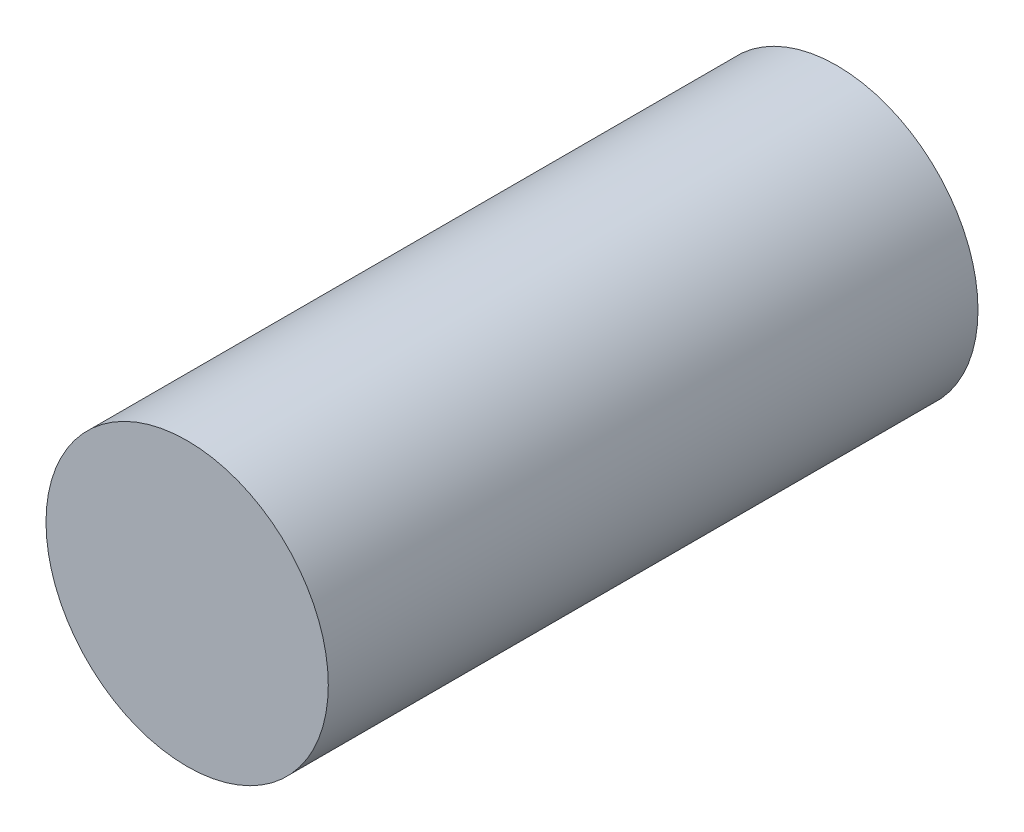
ISO-10303-21;
HEADER;
FILE_DESCRIPTION(('STEP AP214'),'2;1');
FILE_NAME('part.step','',(''),(''),'','','');
FILE_SCHEMA(('AUTOMOTIVE_DESIGN { 1 0 10303 214 1 1 1 1 }'));
ENDSEC;
DATA;
#1=APPLICATION_CONTEXT('core data for automotive mechanical design processes');
#2=APPLICATION_PROTOCOL_DEFINITION('international standard','automotive_design',2000,#1);
#3=PRODUCT_CONTEXT('',#1,'mechanical');
#4=PRODUCT('Part','Part','',(#3));
#5=PRODUCT_RELATED_PRODUCT_CATEGORY('part','',(#4));
#6=PRODUCT_DEFINITION_FORMATION('','',#4);
#7=PRODUCT_DEFINITION_CONTEXT('part definition',#1,'design');
#8=PRODUCT_DEFINITION('design','',#6,#7);
#9=PRODUCT_DEFINITION_SHAPE('','',#8);
#10=(LENGTH_UNIT() NAMED_UNIT(*) SI_UNIT(.MILLI.,.METRE.));
#11=(NAMED_UNIT(*) PLANE_ANGLE_UNIT() SI_UNIT($,.RADIAN.));
#12=(NAMED_UNIT(*) SI_UNIT($,.STERADIAN.) SOLID_ANGLE_UNIT());
#13=UNCERTAINTY_MEASURE_WITH_UNIT(LENGTH_MEASURE(1.E-05),#10,'distance_accuracy_value','');
#14=(GEOMETRIC_REPRESENTATION_CONTEXT(3) GLOBAL_UNCERTAINTY_ASSIGNED_CONTEXT((#13)) GLOBAL_UNIT_ASSIGNED_CONTEXT((#10,
#11,#12)) REPRESENTATION_CONTEXT('',''));
#15=CARTESIAN_POINT('',(0.,0.,0.));
#16=DIRECTION('',(0.,0.,1.));
#17=DIRECTION('',(1.,0.,0.));
#18=AXIS2_PLACEMENT_3D('',#15,#16,#17);
#19=CARTESIAN_POINT('',(0.,0.,41.));
#20=DIRECTION('',(0.,0.,-1.));
#21=DIRECTION('',(-1.,0.,0.));
#22=AXIS2_PLACEMENT_3D('',#19,#20,#21);
#23=CYLINDRICAL_SURFACE('',#22,8.90741859684457);
#24=CARTESIAN_POINT('',(0.,0.,41.));
#25=DIRECTION('',(0.,0.,1.));
#26=DIRECTION('',(1.,0.,0.));
#27=AXIS2_PLACEMENT_3D('',#24,#25,#26);
#28=CIRCLE('',#27,8.90741859684457);
#29=CARTESIAN_POINT('',(8.90741859684457,0.,41.));
#30=VERTEX_POINT('',#29);
#31=EDGE_CURVE('E10',#30,#30,#28,.T.);
#32=ORIENTED_EDGE('',*,*,#31,.F.);
#33=EDGE_LOOP('',(#32));
#34=FACE_BOUND('',#33,.T.);
#35=CARTESIAN_POINT('',(0.,0.,0.));
#36=DIRECTION('',(0.,0.,1.));
#37=DIRECTION('',(1.,0.,0.));
#38=AXIS2_PLACEMENT_3D('',#35,#36,#37);
#39=CIRCLE('',#38,8.90741859684457);
#40=CARTESIAN_POINT('',(8.90741859684457,0.,0.));
#41=VERTEX_POINT('',#40);
#42=EDGE_CURVE('E42',#41,#41,#39,.T.);
#43=ORIENTED_EDGE('',*,*,#42,.T.);
#44=EDGE_LOOP('',(#43));
#45=FACE_BOUND('',#44,.T.);
#46=ADVANCED_FACE('F39',(#34,#45),#23,.T.);
#47=CARTESIAN_POINT('',(0.,0.,41.));
#48=DIRECTION('',(0.,0.,1.));
#49=DIRECTION('',(1.,0.,0.));
#50=AXIS2_PLACEMENT_3D('',#47,#48,#49);
#51=PLANE('',#50);
#52=ORIENTED_EDGE('',*,*,#31,.T.);
#53=EDGE_LOOP('',(#52));
#54=FACE_BOUND('',#53,.T.);
#55=ADVANCED_FACE('F54',(#54),#51,.T.);
#56=CARTESIAN_POINT('',(0.,0.,0.));
#57=DIRECTION('',(0.,0.,1.));
#58=DIRECTION('',(1.,0.,0.));
#59=AXIS2_PLACEMENT_3D('',#56,#57,#58);
#60=PLANE('',#59);
#61=ORIENTED_EDGE('',*,*,#42,.F.);
#62=EDGE_LOOP('',(#61));
#63=FACE_BOUND('',#62,.T.);
#64=ADVANCED_FACE('F52',(#63),#60,.F.);
#65=CLOSED_SHELL('',(#46,#55,#64));
#66=MANIFOLD_SOLID_BREP('B2',#65);
#67=ADVANCED_BREP_SHAPE_REPRESENTATION('',(#18,#66),#14);
#68=SHAPE_DEFINITION_REPRESENTATION(#9,#67);
ENDSEC;
END-ISO-10303-21;
